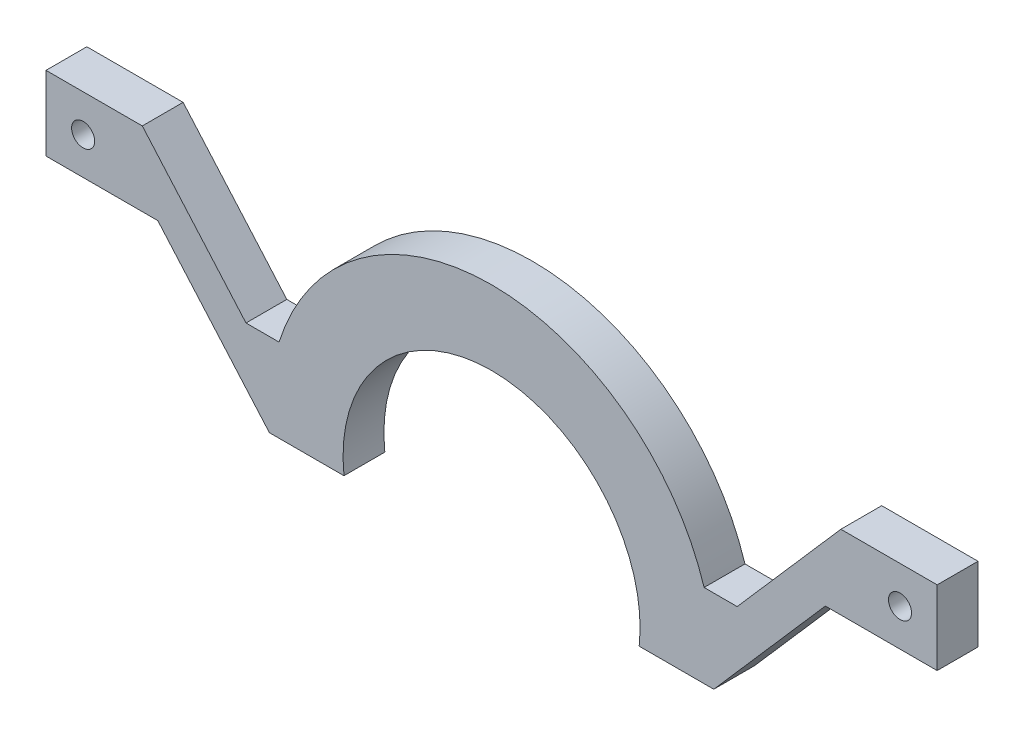
ISO-10303-21;
HEADER;
FILE_DESCRIPTION(('STEP AP214'),'2;1');
FILE_NAME('part.step','',(''),(''),'','','');
FILE_SCHEMA(('AUTOMOTIVE_DESIGN { 1 0 10303 214 1 1 1 1 }'));
ENDSEC;
DATA;
#1=APPLICATION_CONTEXT('core data for automotive mechanical design processes');
#2=APPLICATION_PROTOCOL_DEFINITION('international standard','automotive_design',2000,#1);
#3=PRODUCT_CONTEXT('',#1,'mechanical');
#4=PRODUCT('Part','Part','',(#3));
#5=PRODUCT_RELATED_PRODUCT_CATEGORY('part','',(#4));
#6=PRODUCT_DEFINITION_FORMATION('','',#4);
#7=PRODUCT_DEFINITION_CONTEXT('part definition',#1,'design');
#8=PRODUCT_DEFINITION('design','',#6,#7);
#9=PRODUCT_DEFINITION_SHAPE('','',#8);
#10=(LENGTH_UNIT() NAMED_UNIT(*) SI_UNIT(.MILLI.,.METRE.));
#11=(NAMED_UNIT(*) PLANE_ANGLE_UNIT() SI_UNIT($,.RADIAN.));
#12=(NAMED_UNIT(*) SI_UNIT($,.STERADIAN.) SOLID_ANGLE_UNIT());
#13=UNCERTAINTY_MEASURE_WITH_UNIT(LENGTH_MEASURE(1.E-05),#10,'distance_accuracy_value','');
#14=(GEOMETRIC_REPRESENTATION_CONTEXT(3) GLOBAL_UNCERTAINTY_ASSIGNED_CONTEXT((#13)) GLOBAL_UNIT_ASSIGNED_CONTEXT((#10,
#11,#12)) REPRESENTATION_CONTEXT('',''));
#15=CARTESIAN_POINT('',(0.,0.,0.));
#16=DIRECTION('',(0.,0.,1.));
#17=DIRECTION('',(1.,0.,0.));
#18=AXIS2_PLACEMENT_3D('',#15,#16,#17);
#19=CARTESIAN_POINT('',(-60.0000000000001,-5.00000000000001,5.5));
#20=DIRECTION('',(0.,1.,0.));
#21=DIRECTION('',(0.,0.,1.));
#22=AXIS2_PLACEMENT_3D('',#19,#20,#21);
#23=PLANE('',#22);
#24=DIRECTION('',(1.,0.,0.));
#25=VECTOR('',#24,1.);
#26=CARTESIAN_POINT('',(-60.0000000000001,-5.00000000000001,0.));
#27=LINE('',#26,#25);
#28=CARTESIAN_POINT('',(-60.0000000000001,-5.00000000000001,0.));
#29=VERTEX_POINT('',#28);
#30=CARTESIAN_POINT('',(-44.9429572013847,-5.00000000000001,0.));
#31=VERTEX_POINT('',#30);
#32=EDGE_CURVE('E177',#29,#31,#27,.T.);
#33=ORIENTED_EDGE('',*,*,#32,.T.);
#34=DIRECTION('',(0.,0.,-1.));
#35=VECTOR('',#34,1.);
#36=CARTESIAN_POINT('',(-44.9429572013847,-5.00000000000001,5.5));
#37=LINE('',#36,#35);
#38=CARTESIAN_POINT('',(-44.9429572013847,-5.00000000000001,5.5));
#39=VERTEX_POINT('',#38);
#40=EDGE_CURVE('E11',#39,#31,#37,.T.);
#41=ORIENTED_EDGE('',*,*,#40,.F.);
#42=DIRECTION('',(1.,0.,0.));
#43=VECTOR('',#42,1.);
#44=CARTESIAN_POINT('',(-60.0000000000001,-5.00000000000001,5.5));
#45=LINE('',#44,#43);
#46=CARTESIAN_POINT('',(-60.0000000000001,-5.00000000000001,5.5));
#47=VERTEX_POINT('',#46);
#48=EDGE_CURVE('E208',#47,#39,#45,.T.);
#49=ORIENTED_EDGE('',*,*,#48,.F.);
#50=DIRECTION('',(0.,0.,-1.));
#51=VECTOR('',#50,1.);
#52=CARTESIAN_POINT('',(-60.0000000000001,-5.00000000000001,5.5));
#53=LINE('',#52,#51);
#54=EDGE_CURVE('E173',#47,#29,#53,.T.);
#55=ORIENTED_EDGE('',*,*,#54,.T.);
#56=EDGE_LOOP('',(#33,#41,#49,#55));
#57=FACE_BOUND('',#56,.T.);
#58=ADVANCED_FACE('F33',(#57),#23,.F.);
#59=CARTESIAN_POINT('',(-44.9429572013847,-5.00000000000001,5.5));
#60=DIRECTION('',(0.753454941174337,0.657499544958,0.));
#61=DIRECTION('',(-0.657499544958,0.753454941174337,0.));
#62=AXIS2_PLACEMENT_3D('',#59,#60,#61);
#63=PLANE('',#62);
#64=DIRECTION('',(0.657499544958,-0.753454941174337,0.));
#65=VECTOR('',#64,1.);
#66=CARTESIAN_POINT('',(-44.9429572013847,-5.00000000000001,0.));
#67=LINE('',#66,#65);
#68=CARTESIAN_POINT('',(-29.9179103974281,-22.217800137854,0.));
#69=VERTEX_POINT('',#68);
#70=EDGE_CURVE('E180',#31,#69,#67,.T.);
#71=ORIENTED_EDGE('',*,*,#70,.T.);
#72=DIRECTION('',(0.,0.,-1.));
#73=VECTOR('',#72,1.);
#74=CARTESIAN_POINT('',(-29.9179103974281,-22.217800137854,5.5));
#75=LINE('',#74,#73);
#76=CARTESIAN_POINT('',(-29.9179103974281,-22.217800137854,5.5));
#77=VERTEX_POINT('',#76);
#78=EDGE_CURVE('E41',#77,#69,#75,.T.);
#79=ORIENTED_EDGE('',*,*,#78,.F.);
#80=DIRECTION('',(0.657499544958,-0.753454941174337,0.));
#81=VECTOR('',#80,1.);
#82=CARTESIAN_POINT('',(-44.9429572013847,-5.00000000000001,5.5));
#83=LINE('',#82,#81);
#84=EDGE_CURVE('E116',#39,#77,#83,.T.);
#85=ORIENTED_EDGE('',*,*,#84,.F.);
#86=ORIENTED_EDGE('',*,*,#40,.T.);
#87=EDGE_LOOP('',(#71,#79,#85,#86));
#88=FACE_BOUND('',#87,.T.);
#89=ADVANCED_FACE('F307',(#88),#63,.F.);
#90=CARTESIAN_POINT('',(-29.9179103974281,-22.217800137854,5.5));
#91=DIRECTION('',(0.,1.,0.));
#92=DIRECTION('',(0.,0.,1.));
#93=AXIS2_PLACEMENT_3D('',#90,#91,#92);
#94=PLANE('',#93);
#95=DIRECTION('',(1.,0.,0.));
#96=VECTOR('',#95,1.);
#97=CARTESIAN_POINT('',(-29.9179103974281,-22.217800137854,0.));
#98=LINE('',#97,#96);
#99=CARTESIAN_POINT('',(-19.8766537060073,-22.217800137854,0.));
#100=VERTEX_POINT('',#99);
#101=EDGE_CURVE('E183',#69,#100,#98,.T.);
#102=ORIENTED_EDGE('',*,*,#101,.T.);
#103=DIRECTION('',(0.,0.,-1.));
#104=VECTOR('',#103,1.);
#105=CARTESIAN_POINT('',(-19.8766537060073,-22.217800137854,5.5));
#106=LINE('',#105,#104);
#107=CARTESIAN_POINT('',(-19.8766537060073,-22.217800137854,5.5));
#108=VERTEX_POINT('',#107);
#109=EDGE_CURVE('E239',#108,#100,#106,.T.);
#110=ORIENTED_EDGE('',*,*,#109,.F.);
#111=DIRECTION('',(1.,0.,0.));
#112=VECTOR('',#111,1.);
#113=CARTESIAN_POINT('',(-29.9179103974281,-22.217800137854,5.5));
#114=LINE('',#113,#112);
#115=EDGE_CURVE('E247',#77,#108,#114,.T.);
#116=ORIENTED_EDGE('',*,*,#115,.F.);
#117=ORIENTED_EDGE('',*,*,#78,.T.);
#118=EDGE_LOOP('',(#102,#110,#116,#117));
#119=FACE_BOUND('',#118,.T.);
#120=ADVANCED_FACE('F245',(#119),#94,.F.);
#121=CARTESIAN_POINT('',(0.,-20.,5.5));
#122=DIRECTION('',(0.,0.,-1.));
#123=DIRECTION('',(-1.,0.,0.));
#124=AXIS2_PLACEMENT_3D('',#121,#122,#123);
#125=CYLINDRICAL_SURFACE('',#124,20.);
#126=CARTESIAN_POINT('',(0.,-20.,0.));
#127=DIRECTION('',(0.,0.,-1.));
#128=DIRECTION('',(1.,0.,0.));
#129=AXIS2_PLACEMENT_3D('',#126,#127,#128);
#130=CIRCLE('',#129,20.);
#131=CARTESIAN_POINT('',(19.8766537060073,-22.217800137854,0.));
#132=VERTEX_POINT('',#131);
#133=EDGE_CURVE('E185',#100,#132,#130,.T.);
#134=ORIENTED_EDGE('',*,*,#133,.T.);
#135=DIRECTION('',(0.,0.,-1.));
#136=VECTOR('',#135,1.);
#137=CARTESIAN_POINT('',(19.8766537060073,-22.217800137854,5.5));
#138=LINE('',#137,#136);
#139=CARTESIAN_POINT('',(19.8766537060073,-22.217800137854,5.5));
#140=VERTEX_POINT('',#139);
#141=EDGE_CURVE('E236',#140,#132,#138,.T.);
#142=ORIENTED_EDGE('',*,*,#141,.F.);
#143=CARTESIAN_POINT('',(0.,-20.,5.5));
#144=DIRECTION('',(0.,0.,-1.));
#145=DIRECTION('',(1.,0.,0.));
#146=AXIS2_PLACEMENT_3D('',#143,#144,#145);
#147=CIRCLE('',#146,20.);
#148=EDGE_CURVE('E265',#108,#140,#147,.T.);
#149=ORIENTED_EDGE('',*,*,#148,.F.);
#150=ORIENTED_EDGE('',*,*,#109,.T.);
#151=EDGE_LOOP('',(#134,#142,#149,#150));
#152=FACE_BOUND('',#151,.T.);
#153=ADVANCED_FACE('F256',(#152),#125,.F.);
#154=CARTESIAN_POINT('',(19.8766537060073,-22.217800137854,5.5));
#155=DIRECTION('',(0.,1.,0.));
#156=DIRECTION('',(0.,0.,1.));
#157=AXIS2_PLACEMENT_3D('',#154,#155,#156);
#158=PLANE('',#157);
#159=DIRECTION('',(1.,0.,0.));
#160=VECTOR('',#159,1.);
#161=CARTESIAN_POINT('',(19.8766537060073,-22.217800137854,0.));
#162=LINE('',#161,#160);
#163=CARTESIAN_POINT('',(29.9179103974281,-22.217800137854,0.));
#164=VERTEX_POINT('',#163);
#165=EDGE_CURVE('E187',#132,#164,#162,.T.);
#166=ORIENTED_EDGE('',*,*,#165,.T.);
#167=DIRECTION('',(0.,0.,-1.));
#168=VECTOR('',#167,1.);
#169=CARTESIAN_POINT('',(29.9179103974281,-22.217800137854,5.5));
#170=LINE('',#169,#168);
#171=CARTESIAN_POINT('',(29.9179103974281,-22.217800137854,5.5));
#172=VERTEX_POINT('',#171);
#173=EDGE_CURVE('E233',#172,#164,#170,.T.);
#174=ORIENTED_EDGE('',*,*,#173,.F.);
#175=DIRECTION('',(1.,0.,0.));
#176=VECTOR('',#175,1.);
#177=CARTESIAN_POINT('',(19.8766537060073,-22.217800137854,5.5));
#178=LINE('',#177,#176);
#179=EDGE_CURVE('E262',#140,#172,#178,.T.);
#180=ORIENTED_EDGE('',*,*,#179,.F.);
#181=ORIENTED_EDGE('',*,*,#141,.T.);
#182=EDGE_LOOP('',(#166,#174,#180,#181));
#183=FACE_BOUND('',#182,.T.);
#184=ADVANCED_FACE('F260',(#183),#158,.F.);
#185=CARTESIAN_POINT('',(29.9179103974281,-22.217800137854,5.5));
#186=DIRECTION('',(-0.753454941174336,0.657499544958001,0.));
#187=DIRECTION('',(-0.657499544958001,-0.753454941174336,0.));
#188=AXIS2_PLACEMENT_3D('',#185,#186,#187);
#189=PLANE('',#188);
#190=DIRECTION('',(0.657499544958,0.753454941174336,0.));
#191=VECTOR('',#190,1.);
#192=CARTESIAN_POINT('',(29.9179103974281,-22.217800137854,0.));
#193=LINE('',#192,#191);
#194=CARTESIAN_POINT('',(44.9429572013847,-4.99999999999998,0.));
#195=VERTEX_POINT('',#194);
#196=EDGE_CURVE('E189',#164,#195,#193,.T.);
#197=ORIENTED_EDGE('',*,*,#196,.T.);
#198=DIRECTION('',(0.,0.,-1.));
#199=VECTOR('',#198,1.);
#200=CARTESIAN_POINT('',(44.9429572013847,-4.99999999999998,5.5));
#201=LINE('',#200,#199);
#202=CARTESIAN_POINT('',(44.9429572013847,-4.99999999999998,5.5));
#203=VERTEX_POINT('',#202);
#204=EDGE_CURVE('E230',#203,#195,#201,.T.);
#205=ORIENTED_EDGE('',*,*,#204,.F.);
#206=DIRECTION('',(0.657499544958,0.753454941174336,0.));
#207=VECTOR('',#206,1.);
#208=CARTESIAN_POINT('',(29.9179103974281,-22.217800137854,5.5));
#209=LINE('',#208,#207);
#210=EDGE_CURVE('E264',#172,#203,#209,.T.);
#211=ORIENTED_EDGE('',*,*,#210,.F.);
#212=ORIENTED_EDGE('',*,*,#173,.T.);
#213=EDGE_LOOP('',(#197,#205,#211,#212));
#214=FACE_BOUND('',#213,.T.);
#215=ADVANCED_FACE('F320',(#214),#189,.F.);
#216=CARTESIAN_POINT('',(59.9999999999999,-4.99999999999998,5.5));
#217=DIRECTION('',(0.,1.,0.));
#218=DIRECTION('',(-1.,0.,0.));
#219=AXIS2_PLACEMENT_3D('',#216,#217,#218);
#220=PLANE('',#219);
#221=DIRECTION('',(1.,0.,0.));
#222=VECTOR('',#221,1.);
#223=CARTESIAN_POINT('',(59.9999999999999,-4.99999999999998,0.));
#224=LINE('',#223,#222);
#225=CARTESIAN_POINT('',(59.9999999999999,-4.99999999999998,0.));
#226=VERTEX_POINT('',#225);
#227=EDGE_CURVE('E191',#195,#226,#224,.T.);
#228=ORIENTED_EDGE('',*,*,#227,.T.);
#229=DIRECTION('',(0.,0.,-1.));
#230=VECTOR('',#229,1.);
#231=CARTESIAN_POINT('',(59.9999999999999,-4.99999999999998,5.5));
#232=LINE('',#231,#230);
#233=CARTESIAN_POINT('',(59.9999999999999,-4.99999999999998,5.5));
#234=VERTEX_POINT('',#233);
#235=EDGE_CURVE('E227',#234,#226,#232,.T.);
#236=ORIENTED_EDGE('',*,*,#235,.F.);
#237=DIRECTION('',(1.,0.,0.));
#238=VECTOR('',#237,1.);
#239=CARTESIAN_POINT('',(59.9999999999999,-4.99999999999998,5.5));
#240=LINE('',#239,#238);
#241=EDGE_CURVE('E267',#203,#234,#240,.T.);
#242=ORIENTED_EDGE('',*,*,#241,.F.);
#243=ORIENTED_EDGE('',*,*,#204,.T.);
#244=EDGE_LOOP('',(#228,#236,#242,#243));
#245=FACE_BOUND('',#244,.T.);
#246=ADVANCED_FACE('F323',(#245),#220,.F.);
#247=CARTESIAN_POINT('',(59.9999999999999,4.99999999999999,5.5));
#248=DIRECTION('',(-1.,0.,0.));
#249=DIRECTION('',(0.,0.,1.));
#250=AXIS2_PLACEMENT_3D('',#247,#248,#249);
#251=PLANE('',#250);
#252=DIRECTION('',(0.,1.,0.));
#253=VECTOR('',#252,1.);
#254=CARTESIAN_POINT('',(59.9999999999999,4.99999999999999,0.));
#255=LINE('',#254,#253);
#256=CARTESIAN_POINT('',(59.9999999999999,4.99999999999999,0.));
#257=VERTEX_POINT('',#256);
#258=EDGE_CURVE('E193',#226,#257,#255,.T.);
#259=ORIENTED_EDGE('',*,*,#258,.T.);
#260=DIRECTION('',(0.,0.,-1.));
#261=VECTOR('',#260,1.);
#262=CARTESIAN_POINT('',(59.9999999999999,4.99999999999999,5.5));
#263=LINE('',#262,#261);
#264=CARTESIAN_POINT('',(59.9999999999999,4.99999999999999,5.5));
#265=VERTEX_POINT('',#264);
#266=EDGE_CURVE('E224',#265,#257,#263,.T.);
#267=ORIENTED_EDGE('',*,*,#266,.F.);
#268=DIRECTION('',(0.,1.,0.));
#269=VECTOR('',#268,1.);
#270=CARTESIAN_POINT('',(59.9999999999999,4.99999999999999,5.5));
#271=LINE('',#270,#269);
#272=EDGE_CURVE('E273',#234,#265,#271,.T.);
#273=ORIENTED_EDGE('',*,*,#272,.F.);
#274=ORIENTED_EDGE('',*,*,#235,.T.);
#275=EDGE_LOOP('',(#259,#267,#273,#274));
#276=FACE_BOUND('',#275,.T.);
#277=ADVANCED_FACE('F327',(#276),#251,.F.);
#278=CARTESIAN_POINT('',(47.033321685723,4.99999999999999,5.5));
#279=DIRECTION('',(0.,-1.,0.));
#280=DIRECTION('',(0.,0.,-1.));
#281=AXIS2_PLACEMENT_3D('',#278,#279,#280);
#282=PLANE('',#281);
#283=DIRECTION('',(-1.,0.,0.));
#284=VECTOR('',#283,1.);
#285=CARTESIAN_POINT('',(47.033321685723,4.99999999999999,0.));
#286=LINE('',#285,#284);
#287=CARTESIAN_POINT('',(47.033321685723,4.99999999999999,0.));
#288=VERTEX_POINT('',#287);
#289=EDGE_CURVE('E195',#257,#288,#286,.T.);
#290=ORIENTED_EDGE('',*,*,#289,.T.);
#291=DIRECTION('',(0.,0.,-1.));
#292=VECTOR('',#291,1.);
#293=CARTESIAN_POINT('',(47.033321685723,4.99999999999999,5.5));
#294=LINE('',#293,#292);
#295=CARTESIAN_POINT('',(47.033321685723,4.99999999999999,5.5));
#296=VERTEX_POINT('',#295);
#297=EDGE_CURVE('E221',#296,#288,#294,.T.);
#298=ORIENTED_EDGE('',*,*,#297,.F.);
#299=DIRECTION('',(-1.,0.,0.));
#300=VECTOR('',#299,1.);
#301=CARTESIAN_POINT('',(47.033321685723,4.99999999999999,5.5));
#302=LINE('',#301,#300);
#303=EDGE_CURVE('E275',#265,#296,#302,.T.);
#304=ORIENTED_EDGE('',*,*,#303,.F.);
#305=ORIENTED_EDGE('',*,*,#266,.T.);
#306=EDGE_LOOP('',(#290,#298,#304,#305));
#307=FACE_BOUND('',#306,.T.);
#308=ADVANCED_FACE('F331',(#307),#282,.F.);
#309=CARTESIAN_POINT('',(33.0709834695431,-11.,5.5));
#310=DIRECTION('',(0.753454941174336,-0.657499544958001,0.));
#311=DIRECTION('',(0.657499544958001,0.753454941174336,0.));
#312=AXIS2_PLACEMENT_3D('',#309,#310,#311);
#313=PLANE('',#312);
#314=DIRECTION('',(-0.657499544958,-0.753454941174336,0.));
#315=VECTOR('',#314,1.);
#316=CARTESIAN_POINT('',(33.0709834695431,-11.,0.));
#317=LINE('',#316,#315);
#318=CARTESIAN_POINT('',(33.0709834695431,-11.,0.));
#319=VERTEX_POINT('',#318);
#320=EDGE_CURVE('E197',#288,#319,#317,.T.);
#321=ORIENTED_EDGE('',*,*,#320,.T.);
#322=DIRECTION('',(0.,0.,-1.));
#323=VECTOR('',#322,1.);
#324=CARTESIAN_POINT('',(33.0709834695431,-11.,5.5));
#325=LINE('',#324,#323);
#326=CARTESIAN_POINT('',(33.0709834695431,-11.,5.5));
#327=VERTEX_POINT('',#326);
#328=EDGE_CURVE('E218',#327,#319,#325,.T.);
#329=ORIENTED_EDGE('',*,*,#328,.F.);
#330=DIRECTION('',(-0.657499544958,-0.753454941174336,0.));
#331=VECTOR('',#330,1.);
#332=CARTESIAN_POINT('',(33.0709834695431,-11.,5.5));
#333=LINE('',#332,#331);
#334=EDGE_CURVE('E277',#296,#327,#333,.T.);
#335=ORIENTED_EDGE('',*,*,#334,.F.);
#336=ORIENTED_EDGE('',*,*,#297,.T.);
#337=EDGE_LOOP('',(#321,#329,#335,#336));
#338=FACE_BOUND('',#337,.T.);
#339=ADVANCED_FACE('F335',(#338),#313,.F.);
#340=CARTESIAN_POINT('',(28.6181760425084,-11.,5.5));
#341=DIRECTION('',(0.,-1.,0.));
#342=DIRECTION('',(1.,0.,0.));
#343=AXIS2_PLACEMENT_3D('',#340,#341,#342);
#344=PLANE('',#343);
#345=DIRECTION('',(-1.,0.,0.));
#346=VECTOR('',#345,1.);
#347=CARTESIAN_POINT('',(28.6181760425084,-11.,0.));
#348=LINE('',#347,#346);
#349=CARTESIAN_POINT('',(28.6181760425084,-11.,0.));
#350=VERTEX_POINT('',#349);
#351=EDGE_CURVE('E199',#319,#350,#348,.T.);
#352=ORIENTED_EDGE('',*,*,#351,.T.);
#353=DIRECTION('',(0.,0.,-1.));
#354=VECTOR('',#353,1.);
#355=CARTESIAN_POINT('',(28.6181760425084,-11.,5.5));
#356=LINE('',#355,#354);
#357=CARTESIAN_POINT('',(28.6181760425084,-11.,5.5));
#358=VERTEX_POINT('',#357);
#359=EDGE_CURVE('E215',#358,#350,#356,.T.);
#360=ORIENTED_EDGE('',*,*,#359,.F.);
#361=DIRECTION('',(-1.,0.,0.));
#362=VECTOR('',#361,1.);
#363=CARTESIAN_POINT('',(28.6181760425084,-11.,5.5));
#364=LINE('',#363,#362);
#365=EDGE_CURVE('E279',#327,#358,#364,.T.);
#366=ORIENTED_EDGE('',*,*,#365,.F.);
#367=ORIENTED_EDGE('',*,*,#328,.T.);
#368=EDGE_LOOP('',(#352,#360,#366,#367));
#369=FACE_BOUND('',#368,.T.);
#370=ADVANCED_FACE('F339',(#369),#344,.F.);
#371=CARTESIAN_POINT('',(0.,-20.,5.5));
#372=DIRECTION('',(0.,0.,-1.));
#373=DIRECTION('',(-1.,0.,0.));
#374=AXIS2_PLACEMENT_3D('',#371,#372,#373);
#375=CYLINDRICAL_SURFACE('',#374,30.);
#376=CARTESIAN_POINT('',(0.,-20.,0.));
#377=DIRECTION('',(0.,0.,1.));
#378=DIRECTION('',(-1.,0.,0.));
#379=AXIS2_PLACEMENT_3D('',#376,#377,#378);
#380=CIRCLE('',#379,30.);
#381=CARTESIAN_POINT('',(-28.6181760425084,-11.,0.));
#382=VERTEX_POINT('',#381);
#383=EDGE_CURVE('E201',#350,#382,#380,.T.);
#384=ORIENTED_EDGE('',*,*,#383,.T.);
#385=DIRECTION('',(0.,0.,-1.));
#386=VECTOR('',#385,1.);
#387=CARTESIAN_POINT('',(-28.6181760425084,-11.,5.5));
#388=LINE('',#387,#386);
#389=CARTESIAN_POINT('',(-28.6181760425084,-11.,5.5));
#390=VERTEX_POINT('',#389);
#391=EDGE_CURVE('E212',#390,#382,#388,.T.);
#392=ORIENTED_EDGE('',*,*,#391,.F.);
#393=CARTESIAN_POINT('',(0.,-20.,5.5));
#394=DIRECTION('',(0.,0.,1.));
#395=DIRECTION('',(-1.,0.,0.));
#396=AXIS2_PLACEMENT_3D('',#393,#394,#395);
#397=CIRCLE('',#396,30.);
#398=EDGE_CURVE('E281',#358,#390,#397,.T.);
#399=ORIENTED_EDGE('',*,*,#398,.F.);
#400=ORIENTED_EDGE('',*,*,#359,.T.);
#401=EDGE_LOOP('',(#384,#392,#399,#400));
#402=FACE_BOUND('',#401,.T.);
#403=ADVANCED_FACE('F287',(#402),#375,.T.);
#404=CARTESIAN_POINT('',(-33.070983469543,-11.,5.5));
#405=DIRECTION('',(0.,-1.,0.));
#406=DIRECTION('',(1.,0.,0.));
#407=AXIS2_PLACEMENT_3D('',#404,#405,#406);
#408=PLANE('',#407);
#409=DIRECTION('',(-1.,0.,0.));
#410=VECTOR('',#409,1.);
#411=CARTESIAN_POINT('',(-33.070983469543,-11.,0.));
#412=LINE('',#411,#410);
#413=CARTESIAN_POINT('',(-33.070983469543,-11.,0.));
#414=VERTEX_POINT('',#413);
#415=EDGE_CURVE('E203',#382,#414,#412,.T.);
#416=ORIENTED_EDGE('',*,*,#415,.T.);
#417=DIRECTION('',(0.,0.,-1.));
#418=VECTOR('',#417,1.);
#419=CARTESIAN_POINT('',(-33.070983469543,-11.,5.5));
#420=LINE('',#419,#418);
#421=CARTESIAN_POINT('',(-33.070983469543,-11.,5.5));
#422=VERTEX_POINT('',#421);
#423=EDGE_CURVE('E168',#422,#414,#420,.T.);
#424=ORIENTED_EDGE('',*,*,#423,.F.);
#425=DIRECTION('',(-1.,0.,0.));
#426=VECTOR('',#425,1.);
#427=CARTESIAN_POINT('',(-33.070983469543,-11.,5.5));
#428=LINE('',#427,#426);
#429=EDGE_CURVE('E159',#390,#422,#428,.T.);
#430=ORIENTED_EDGE('',*,*,#429,.F.);
#431=ORIENTED_EDGE('',*,*,#391,.T.);
#432=EDGE_LOOP('',(#416,#424,#430,#431));
#433=FACE_BOUND('',#432,.T.);
#434=ADVANCED_FACE('F291',(#433),#408,.F.);
#435=CARTESIAN_POINT('',(-47.0333216857229,4.99999999999999,5.5));
#436=DIRECTION('',(-0.753454941174336,-0.657499544958001,0.));
#437=DIRECTION('',(0.657499544958001,-0.753454941174336,0.));
#438=AXIS2_PLACEMENT_3D('',#435,#436,#437);
#439=PLANE('',#438);
#440=DIRECTION('',(-0.657499544958001,0.753454941174336,0.));
#441=VECTOR('',#440,1.);
#442=CARTESIAN_POINT('',(-47.0333216857229,4.99999999999999,0.));
#443=LINE('',#442,#441);
#444=CARTESIAN_POINT('',(-47.0333216857229,4.99999999999999,0.));
#445=VERTEX_POINT('',#444);
#446=EDGE_CURVE('E167',#414,#445,#443,.T.);
#447=ORIENTED_EDGE('',*,*,#446,.T.);
#448=DIRECTION('',(0.,0.,-1.));
#449=VECTOR('',#448,1.);
#450=CARTESIAN_POINT('',(-47.0333216857229,4.99999999999999,5.5));
#451=LINE('',#450,#449);
#452=CARTESIAN_POINT('',(-47.0333216857229,4.99999999999999,5.5));
#453=VERTEX_POINT('',#452);
#454=EDGE_CURVE('E164',#453,#445,#451,.T.);
#455=ORIENTED_EDGE('',*,*,#454,.F.);
#456=DIRECTION('',(-0.657499544958001,0.753454941174336,0.));
#457=VECTOR('',#456,1.);
#458=CARTESIAN_POINT('',(-47.0333216857229,4.99999999999999,5.5));
#459=LINE('',#458,#457);
#460=EDGE_CURVE('E153',#422,#453,#459,.T.);
#461=ORIENTED_EDGE('',*,*,#460,.F.);
#462=ORIENTED_EDGE('',*,*,#423,.T.);
#463=EDGE_LOOP('',(#447,#455,#461,#462));
#464=FACE_BOUND('',#463,.T.);
#465=ADVANCED_FACE('F165',(#464),#439,.F.);
#466=CARTESIAN_POINT('',(-60.0000000000001,4.99999999999999,5.5));
#467=DIRECTION('',(0.,-1.,0.));
#468=DIRECTION('',(0.,0.,-1.));
#469=AXIS2_PLACEMENT_3D('',#466,#467,#468);
#470=PLANE('',#469);
#471=DIRECTION('',(-1.,0.,0.));
#472=VECTOR('',#471,1.);
#473=CARTESIAN_POINT('',(-60.0000000000001,4.99999999999999,0.));
#474=LINE('',#473,#472);
#475=CARTESIAN_POINT('',(-60.0000000000001,4.99999999999999,0.));
#476=VERTEX_POINT('',#475);
#477=EDGE_CURVE('E102',#445,#476,#474,.T.);
#478=ORIENTED_EDGE('',*,*,#477,.T.);
#479=DIRECTION('',(0.,0.,-1.));
#480=VECTOR('',#479,1.);
#481=CARTESIAN_POINT('',(-60.0000000000001,4.99999999999999,5.5));
#482=LINE('',#481,#480);
#483=CARTESIAN_POINT('',(-60.0000000000001,4.99999999999999,5.5));
#484=VERTEX_POINT('',#483);
#485=EDGE_CURVE('E169',#484,#476,#482,.T.);
#486=ORIENTED_EDGE('',*,*,#485,.F.);
#487=DIRECTION('',(-1.,0.,0.));
#488=VECTOR('',#487,1.);
#489=CARTESIAN_POINT('',(-60.0000000000001,4.99999999999999,5.5));
#490=LINE('',#489,#488);
#491=EDGE_CURVE('E157',#453,#484,#490,.T.);
#492=ORIENTED_EDGE('',*,*,#491,.F.);
#493=ORIENTED_EDGE('',*,*,#454,.T.);
#494=EDGE_LOOP('',(#478,#486,#492,#493));
#495=FACE_BOUND('',#494,.T.);
#496=ADVANCED_FACE('F171',(#495),#470,.F.);
#497=CARTESIAN_POINT('',(-60.0000000000001,4.99999999999999,5.5));
#498=DIRECTION('',(1.,0.,0.));
#499=DIRECTION('',(0.,0.,-1.));
#500=AXIS2_PLACEMENT_3D('',#497,#498,#499);
#501=PLANE('',#500);
#502=DIRECTION('',(0.,-1.,0.));
#503=VECTOR('',#502,1.);
#504=CARTESIAN_POINT('',(-60.0000000000001,4.99999999999999,0.));
#505=LINE('',#504,#503);
#506=EDGE_CURVE('E108',#476,#29,#505,.T.);
#507=ORIENTED_EDGE('',*,*,#506,.T.);
#508=ORIENTED_EDGE('',*,*,#54,.F.);
#509=DIRECTION('',(0.,-1.,0.));
#510=VECTOR('',#509,1.);
#511=CARTESIAN_POINT('',(-60.0000000000001,4.99999999999999,5.5));
#512=LINE('',#511,#510);
#513=EDGE_CURVE('E49',#484,#47,#512,.T.);
#514=ORIENTED_EDGE('',*,*,#513,.F.);
#515=ORIENTED_EDGE('',*,*,#485,.T.);
#516=EDGE_LOOP('',(#507,#508,#514,#515));
#517=FACE_BOUND('',#516,.T.);
#518=ADVANCED_FACE('F295',(#517),#501,.F.);
#519=CARTESIAN_POINT('',(0.,-20.,5.5));
#520=DIRECTION('',(0.,0.,1.));
#521=DIRECTION('',(1.,0.,0.));
#522=AXIS2_PLACEMENT_3D('',#519,#520,#521);
#523=PLANE('',#522);
#524=CARTESIAN_POINT('',(-55.,0.,5.5));
#525=DIRECTION('',(0.,0.,1.));
#526=DIRECTION('',(1.,0.,0.));
#527=AXIS2_PLACEMENT_3D('',#524,#525,#526);
#528=CIRCLE('',#527,1.55);
#529=CARTESIAN_POINT('',(-53.45,0.,5.5));
#530=VERTEX_POINT('',#529);
#531=EDGE_CURVE('E404',#530,#530,#528,.T.);
#532=ORIENTED_EDGE('',*,*,#531,.F.);
#533=EDGE_LOOP('',(#532));
#534=FACE_BOUND('',#533,.T.);
#535=CARTESIAN_POINT('',(55.,0.,5.5));
#536=DIRECTION('',(0.,0.,1.));
#537=DIRECTION('',(1.,0.,0.));
#538=AXIS2_PLACEMENT_3D('',#535,#536,#537);
#539=CIRCLE('',#538,1.55);
#540=CARTESIAN_POINT('',(56.55,0.,5.5));
#541=VERTEX_POINT('',#540);
#542=EDGE_CURVE('E409',#541,#541,#539,.T.);
#543=ORIENTED_EDGE('',*,*,#542,.F.);
#544=EDGE_LOOP('',(#543));
#545=FACE_BOUND('',#544,.T.);
#546=ORIENTED_EDGE('',*,*,#48,.T.);
#547=ORIENTED_EDGE('',*,*,#84,.T.);
#548=ORIENTED_EDGE('',*,*,#115,.T.);
#549=ORIENTED_EDGE('',*,*,#148,.T.);
#550=ORIENTED_EDGE('',*,*,#179,.T.);
#551=ORIENTED_EDGE('',*,*,#210,.T.);
#552=ORIENTED_EDGE('',*,*,#241,.T.);
#553=ORIENTED_EDGE('',*,*,#272,.T.);
#554=ORIENTED_EDGE('',*,*,#303,.T.);
#555=ORIENTED_EDGE('',*,*,#334,.T.);
#556=ORIENTED_EDGE('',*,*,#365,.T.);
#557=ORIENTED_EDGE('',*,*,#398,.T.);
#558=ORIENTED_EDGE('',*,*,#429,.T.);
#559=ORIENTED_EDGE('',*,*,#460,.T.);
#560=ORIENTED_EDGE('',*,*,#491,.T.);
#561=ORIENTED_EDGE('',*,*,#513,.T.);
#562=EDGE_LOOP('',(#546,#547,#548,#549,#550,#551,#552,#553,#554,#555,#556,#557,#558,#559,#560,#561));
#563=FACE_BOUND('',#562,.T.);
#564=ADVANCED_FACE('F155',(#534,#545,#563),#523,.T.);
#565=CARTESIAN_POINT('',(0.,-20.,0.));
#566=DIRECTION('',(0.,0.,1.));
#567=DIRECTION('',(1.,0.,0.));
#568=AXIS2_PLACEMENT_3D('',#565,#566,#567);
#569=PLANE('',#568);
#570=CARTESIAN_POINT('',(-55.,0.,0.));
#571=DIRECTION('',(0.,0.,1.));
#572=DIRECTION('',(1.,0.,0.));
#573=AXIS2_PLACEMENT_3D('',#570,#571,#572);
#574=CIRCLE('',#573,1.55);
#575=CARTESIAN_POINT('',(-53.45,0.,0.));
#576=VERTEX_POINT('',#575);
#577=EDGE_CURVE('E181',#576,#576,#574,.T.);
#578=ORIENTED_EDGE('',*,*,#577,.T.);
#579=EDGE_LOOP('',(#578));
#580=FACE_BOUND('',#579,.T.);
#581=CARTESIAN_POINT('',(55.,0.,0.));
#582=DIRECTION('',(0.,0.,1.));
#583=DIRECTION('',(1.,0.,0.));
#584=AXIS2_PLACEMENT_3D('',#581,#582,#583);
#585=CIRCLE('',#584,1.55);
#586=CARTESIAN_POINT('',(56.55,0.,0.));
#587=VERTEX_POINT('',#586);
#588=EDGE_CURVE('E405',#587,#587,#585,.T.);
#589=ORIENTED_EDGE('',*,*,#588,.T.);
#590=EDGE_LOOP('',(#589));
#591=FACE_BOUND('',#590,.T.);
#592=ORIENTED_EDGE('',*,*,#32,.F.);
#593=ORIENTED_EDGE('',*,*,#506,.F.);
#594=ORIENTED_EDGE('',*,*,#477,.F.);
#595=ORIENTED_EDGE('',*,*,#446,.F.);
#596=ORIENTED_EDGE('',*,*,#415,.F.);
#597=ORIENTED_EDGE('',*,*,#383,.F.);
#598=ORIENTED_EDGE('',*,*,#351,.F.);
#599=ORIENTED_EDGE('',*,*,#320,.F.);
#600=ORIENTED_EDGE('',*,*,#289,.F.);
#601=ORIENTED_EDGE('',*,*,#258,.F.);
#602=ORIENTED_EDGE('',*,*,#227,.F.);
#603=ORIENTED_EDGE('',*,*,#196,.F.);
#604=ORIENTED_EDGE('',*,*,#165,.F.);
#605=ORIENTED_EDGE('',*,*,#133,.F.);
#606=ORIENTED_EDGE('',*,*,#101,.F.);
#607=ORIENTED_EDGE('',*,*,#70,.F.);
#608=EDGE_LOOP('',(#592,#593,#594,#595,#596,#597,#598,#599,#600,#601,#602,#603,#604,#605,#606,#607));
#609=FACE_BOUND('',#608,.T.);
#610=ADVANCED_FACE('F251',(#580,#591,#609),#569,.F.);
#611=CARTESIAN_POINT('',(55.,0.,0.));
#612=DIRECTION('',(0.,0.,1.));
#613=DIRECTION('',(1.,0.,0.));
#614=AXIS2_PLACEMENT_3D('',#611,#612,#613);
#615=CYLINDRICAL_SURFACE('',#614,1.55);
#616=ORIENTED_EDGE('',*,*,#588,.F.);
#617=EDGE_LOOP('',(#616));
#618=FACE_BOUND('',#617,.T.);
#619=ORIENTED_EDGE('',*,*,#542,.T.);
#620=EDGE_LOOP('',(#619));
#621=FACE_BOUND('',#620,.T.);
#622=ADVANCED_FACE('F376',(#618,#621),#615,.F.);
#623=CARTESIAN_POINT('',(-55.,0.,0.));
#624=DIRECTION('',(0.,0.,1.));
#625=DIRECTION('',(1.,0.,0.));
#626=AXIS2_PLACEMENT_3D('',#623,#624,#625);
#627=CYLINDRICAL_SURFACE('',#626,1.55);
#628=ORIENTED_EDGE('',*,*,#577,.F.);
#629=EDGE_LOOP('',(#628));
#630=FACE_BOUND('',#629,.T.);
#631=ORIENTED_EDGE('',*,*,#531,.T.);
#632=EDGE_LOOP('',(#631));
#633=FACE_BOUND('',#632,.T.);
#634=ADVANCED_FACE('F385',(#630,#633),#627,.F.);
#635=CLOSED_SHELL('',(#58,#89,#120,#153,#184,#215,#246,#277,#308,#339,#370,#403,#434,#465,#496,
#518,#564,#610,#622,#634));
#636=MANIFOLD_SOLID_BREP('B2',#635);
#637=ADVANCED_BREP_SHAPE_REPRESENTATION('',(#18,#636),#14);
#638=SHAPE_DEFINITION_REPRESENTATION(#9,#637);
ENDSEC;
END-ISO-10303-21;
